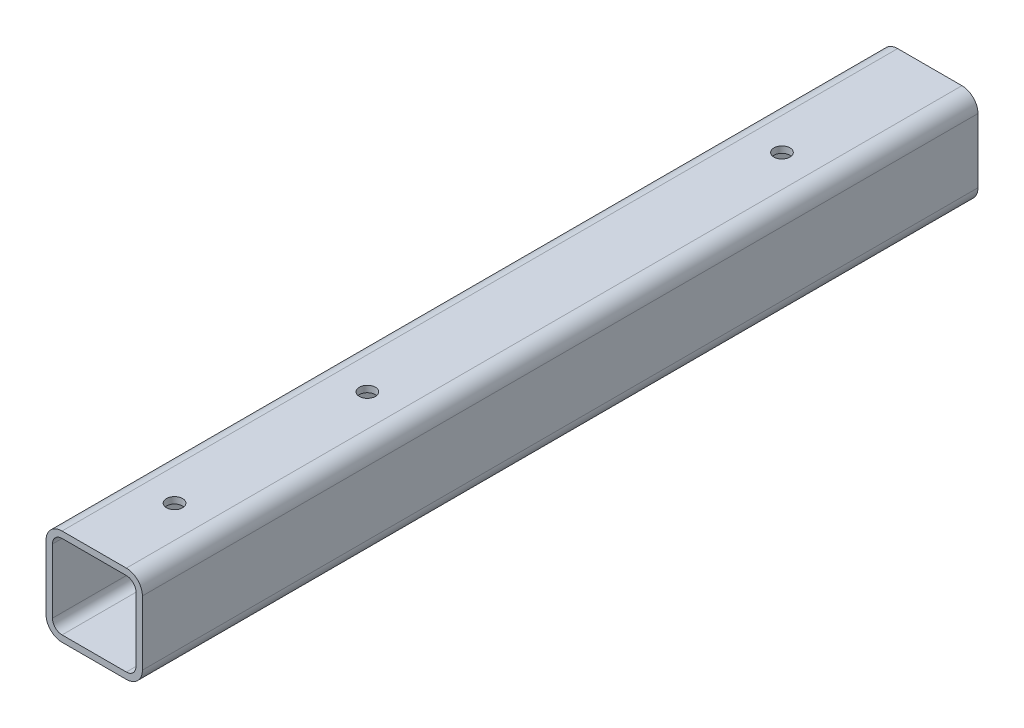
ISO-10303-21;
HEADER;
FILE_DESCRIPTION(('STEP AP214'),'2;1');
FILE_NAME('part.step','',(''),(''),'','','');
FILE_SCHEMA(('AUTOMOTIVE_DESIGN { 1 0 10303 214 1 1 1 1 }'));
ENDSEC;
DATA;
#1=APPLICATION_CONTEXT('core data for automotive mechanical design processes');
#2=APPLICATION_PROTOCOL_DEFINITION('international standard','automotive_design',2000,#1);
#3=PRODUCT_CONTEXT('',#1,'mechanical');
#4=PRODUCT('Part','Part','',(#3));
#5=PRODUCT_RELATED_PRODUCT_CATEGORY('part','',(#4));
#6=PRODUCT_DEFINITION_FORMATION('','',#4);
#7=PRODUCT_DEFINITION_CONTEXT('part definition',#1,'design');
#8=PRODUCT_DEFINITION('design','',#6,#7);
#9=PRODUCT_DEFINITION_SHAPE('','',#8);
#10=(LENGTH_UNIT() NAMED_UNIT(*) SI_UNIT(.MILLI.,.METRE.));
#11=(NAMED_UNIT(*) PLANE_ANGLE_UNIT() SI_UNIT($,.RADIAN.));
#12=(NAMED_UNIT(*) SI_UNIT($,.STERADIAN.) SOLID_ANGLE_UNIT());
#13=UNCERTAINTY_MEASURE_WITH_UNIT(LENGTH_MEASURE(1.E-05),#10,'distance_accuracy_value','');
#14=(GEOMETRIC_REPRESENTATION_CONTEXT(3) GLOBAL_UNCERTAINTY_ASSIGNED_CONTEXT((#13)) GLOBAL_UNIT_ASSIGNED_CONTEXT((#10,
#11,#12)) REPRESENTATION_CONTEXT('',''));
#15=CARTESIAN_POINT('',(0.,0.,0.));
#16=DIRECTION('',(0.,0.,1.));
#17=DIRECTION('',(1.,0.,0.));
#18=AXIS2_PLACEMENT_3D('',#15,#16,#17);
#19=CARTESIAN_POINT('',(10.,10.,130.));
#20=DIRECTION('',(0.,0.,-1.));
#21=DIRECTION('',(-1.,0.,0.));
#22=AXIS2_PLACEMENT_3D('',#19,#20,#21);
#23=PLANE('',#22);
#24=CARTESIAN_POINT('',(10.,10.,130.));
#25=DIRECTION('',(0.,0.,1.));
#26=DIRECTION('',(-1.,0.,0.));
#27=AXIS2_PLACEMENT_3D('',#24,#25,#26);
#28=CIRCLE('',#27,5.);
#29=CARTESIAN_POINT('',(15.,10.,130.));
#30=VERTEX_POINT('',#29);
#31=CARTESIAN_POINT('',(10.,15.,130.));
#32=VERTEX_POINT('',#31);
#33=EDGE_CURVE('E219',#30,#32,#28,.T.);
#34=ORIENTED_EDGE('',*,*,#33,.T.);
#35=DIRECTION('',(-1.,0.,0.));
#36=VECTOR('',#35,1.);
#37=CARTESIAN_POINT('',(-10.,15.,130.));
#38=LINE('',#37,#36);
#39=CARTESIAN_POINT('',(-10.,15.,130.));
#40=VERTEX_POINT('',#39);
#41=EDGE_CURVE('E222',#32,#40,#38,.T.);
#42=ORIENTED_EDGE('',*,*,#41,.T.);
#43=CARTESIAN_POINT('',(-10.,10.,130.));
#44=DIRECTION('',(0.,0.,1.));
#45=DIRECTION('',(1.,0.,0.));
#46=AXIS2_PLACEMENT_3D('',#43,#44,#45);
#47=CIRCLE('',#46,5.);
#48=CARTESIAN_POINT('',(-15.,10.,130.));
#49=VERTEX_POINT('',#48);
#50=EDGE_CURVE('E225',#40,#49,#47,.T.);
#51=ORIENTED_EDGE('',*,*,#50,.T.);
#52=DIRECTION('',(0.,-1.,0.));
#53=VECTOR('',#52,1.);
#54=CARTESIAN_POINT('',(-15.,10.,130.));
#55=LINE('',#54,#53);
#56=CARTESIAN_POINT('',(-15.,-10.,130.));
#57=VERTEX_POINT('',#56);
#58=EDGE_CURVE('E227',#49,#57,#55,.T.);
#59=ORIENTED_EDGE('',*,*,#58,.T.);
#60=CARTESIAN_POINT('',(-10.,-10.,130.));
#61=DIRECTION('',(0.,0.,1.));
#62=DIRECTION('',(-1.,0.,0.));
#63=AXIS2_PLACEMENT_3D('',#60,#61,#62);
#64=CIRCLE('',#63,5.);
#65=CARTESIAN_POINT('',(-10.,-15.,130.));
#66=VERTEX_POINT('',#65);
#67=EDGE_CURVE('E229',#57,#66,#64,.T.);
#68=ORIENTED_EDGE('',*,*,#67,.T.);
#69=DIRECTION('',(1.,0.,0.));
#70=VECTOR('',#69,1.);
#71=CARTESIAN_POINT('',(-10.,-15.,130.));
#72=LINE('',#71,#70);
#73=CARTESIAN_POINT('',(10.,-15.,130.));
#74=VERTEX_POINT('',#73);
#75=EDGE_CURVE('E231',#66,#74,#72,.T.);
#76=ORIENTED_EDGE('',*,*,#75,.T.);
#77=CARTESIAN_POINT('',(10.,-10.,130.));
#78=DIRECTION('',(0.,0.,1.));
#79=DIRECTION('',(1.,0.,0.));
#80=AXIS2_PLACEMENT_3D('',#77,#78,#79);
#81=CIRCLE('',#80,5.);
#82=CARTESIAN_POINT('',(15.,-10.,130.));
#83=VERTEX_POINT('',#82);
#84=EDGE_CURVE('E233',#74,#83,#81,.T.);
#85=ORIENTED_EDGE('',*,*,#84,.T.);
#86=DIRECTION('',(0.,1.,0.));
#87=VECTOR('',#86,1.);
#88=CARTESIAN_POINT('',(15.,10.,130.));
#89=LINE('',#88,#87);
#90=EDGE_CURVE('E235',#83,#30,#89,.T.);
#91=ORIENTED_EDGE('',*,*,#90,.T.);
#92=EDGE_LOOP('',(#34,#42,#51,#59,#68,#76,#85,#91));
#93=FACE_BOUND('',#92,.T.);
#94=CARTESIAN_POINT('',(-10.,10.,130.));
#95=DIRECTION('',(0.,0.,1.));
#96=DIRECTION('',(1.,0.,0.));
#97=AXIS2_PLACEMENT_3D('',#94,#95,#96);
#98=CIRCLE('',#97,3.);
#99=CARTESIAN_POINT('',(-10.,13.,130.));
#100=VERTEX_POINT('',#99);
#101=CARTESIAN_POINT('',(-13.,10.,130.));
#102=VERTEX_POINT('',#101);
#103=EDGE_CURVE('E152',#100,#102,#98,.T.);
#104=ORIENTED_EDGE('',*,*,#103,.F.);
#105=DIRECTION('',(-1.,0.,0.));
#106=VECTOR('',#105,1.);
#107=CARTESIAN_POINT('',(-10.,13.,130.));
#108=LINE('',#107,#106);
#109=CARTESIAN_POINT('',(10.,13.,130.));
#110=VERTEX_POINT('',#109);
#111=EDGE_CURVE('E186',#110,#100,#108,.T.);
#112=ORIENTED_EDGE('',*,*,#111,.F.);
#113=CARTESIAN_POINT('',(10.,10.,130.));
#114=DIRECTION('',(0.,0.,1.));
#115=DIRECTION('',(-1.,0.,0.));
#116=AXIS2_PLACEMENT_3D('',#113,#114,#115);
#117=CIRCLE('',#116,3.);
#118=CARTESIAN_POINT('',(13.,10.,130.));
#119=VERTEX_POINT('',#118);
#120=EDGE_CURVE('E184',#119,#110,#117,.T.);
#121=ORIENTED_EDGE('',*,*,#120,.F.);
#122=DIRECTION('',(0.,1.,0.));
#123=VECTOR('',#122,1.);
#124=CARTESIAN_POINT('',(13.,10.,130.));
#125=LINE('',#124,#123);
#126=CARTESIAN_POINT('',(13.,-10.,130.));
#127=VERTEX_POINT('',#126);
#128=EDGE_CURVE('E182',#127,#119,#125,.T.);
#129=ORIENTED_EDGE('',*,*,#128,.F.);
#130=CARTESIAN_POINT('',(10.,-10.,130.));
#131=DIRECTION('',(0.,0.,1.));
#132=DIRECTION('',(1.,0.,0.));
#133=AXIS2_PLACEMENT_3D('',#130,#131,#132);
#134=CIRCLE('',#133,3.);
#135=CARTESIAN_POINT('',(10.,-13.,130.));
#136=VERTEX_POINT('',#135);
#137=EDGE_CURVE('E180',#136,#127,#134,.T.);
#138=ORIENTED_EDGE('',*,*,#137,.F.);
#139=DIRECTION('',(1.,0.,0.));
#140=VECTOR('',#139,1.);
#141=CARTESIAN_POINT('',(-10.,-13.,130.));
#142=LINE('',#141,#140);
#143=CARTESIAN_POINT('',(-10.,-13.,130.));
#144=VERTEX_POINT('',#143);
#145=EDGE_CURVE('E175',#144,#136,#142,.T.);
#146=ORIENTED_EDGE('',*,*,#145,.F.);
#147=CARTESIAN_POINT('',(-10.,-10.,130.));
#148=DIRECTION('',(0.,0.,1.));
#149=DIRECTION('',(-1.,0.,0.));
#150=AXIS2_PLACEMENT_3D('',#147,#148,#149);
#151=CIRCLE('',#150,3.);
#152=CARTESIAN_POINT('',(-13.,-10.,130.));
#153=VERTEX_POINT('',#152);
#154=EDGE_CURVE('E173',#153,#144,#151,.T.);
#155=ORIENTED_EDGE('',*,*,#154,.F.);
#156=DIRECTION('',(0.,-1.,0.));
#157=VECTOR('',#156,1.);
#158=CARTESIAN_POINT('',(-13.,10.,130.));
#159=LINE('',#158,#157);
#160=EDGE_CURVE('E160',#102,#153,#159,.T.);
#161=ORIENTED_EDGE('',*,*,#160,.F.);
#162=EDGE_LOOP('',(#104,#112,#121,#129,#138,#146,#155,#161));
#163=FACE_BOUND('',#162,.T.);
#164=ADVANCED_FACE('F37',(#93,#163),#23,.F.);
#165=CARTESIAN_POINT('',(10.,10.,-130.));
#166=DIRECTION('',(0.,0.,-1.));
#167=DIRECTION('',(-1.,0.,0.));
#168=AXIS2_PLACEMENT_3D('',#165,#166,#167);
#169=PLANE('',#168);
#170=CARTESIAN_POINT('',(10.,10.,-130.));
#171=DIRECTION('',(0.,0.,1.));
#172=DIRECTION('',(-1.,0.,0.));
#173=AXIS2_PLACEMENT_3D('',#170,#171,#172);
#174=CIRCLE('',#173,5.);
#175=CARTESIAN_POINT('',(15.,10.,-130.));
#176=VERTEX_POINT('',#175);
#177=CARTESIAN_POINT('',(10.,15.,-130.));
#178=VERTEX_POINT('',#177);
#179=EDGE_CURVE('E168',#176,#178,#174,.T.);
#180=ORIENTED_EDGE('',*,*,#179,.F.);
#181=DIRECTION('',(0.,1.,0.));
#182=VECTOR('',#181,1.);
#183=CARTESIAN_POINT('',(15.,10.,-130.));
#184=LINE('',#183,#182);
#185=CARTESIAN_POINT('',(15.,-10.,-130.));
#186=VERTEX_POINT('',#185);
#187=EDGE_CURVE('E223',#186,#176,#184,.T.);
#188=ORIENTED_EDGE('',*,*,#187,.F.);
#189=CARTESIAN_POINT('',(10.,-10.,-130.));
#190=DIRECTION('',(0.,0.,1.));
#191=DIRECTION('',(1.,0.,0.));
#192=AXIS2_PLACEMENT_3D('',#189,#190,#191);
#193=CIRCLE('',#192,5.);
#194=CARTESIAN_POINT('',(10.,-15.,-130.));
#195=VERTEX_POINT('',#194);
#196=EDGE_CURVE('E250',#195,#186,#193,.T.);
#197=ORIENTED_EDGE('',*,*,#196,.F.);
#198=DIRECTION('',(1.,0.,0.));
#199=VECTOR('',#198,1.);
#200=CARTESIAN_POINT('',(-10.,-15.,-130.));
#201=LINE('',#200,#199);
#202=CARTESIAN_POINT('',(-10.,-15.,-130.));
#203=VERTEX_POINT('',#202);
#204=EDGE_CURVE('E248',#203,#195,#201,.T.);
#205=ORIENTED_EDGE('',*,*,#204,.F.);
#206=CARTESIAN_POINT('',(-10.,-10.,-130.));
#207=DIRECTION('',(0.,0.,1.));
#208=DIRECTION('',(-1.,0.,0.));
#209=AXIS2_PLACEMENT_3D('',#206,#207,#208);
#210=CIRCLE('',#209,5.);
#211=CARTESIAN_POINT('',(-15.,-10.,-130.));
#212=VERTEX_POINT('',#211);
#213=EDGE_CURVE('E246',#212,#203,#210,.T.);
#214=ORIENTED_EDGE('',*,*,#213,.F.);
#215=DIRECTION('',(0.,-1.,0.));
#216=VECTOR('',#215,1.);
#217=CARTESIAN_POINT('',(-15.,10.,-130.));
#218=LINE('',#217,#216);
#219=CARTESIAN_POINT('',(-15.,10.,-130.));
#220=VERTEX_POINT('',#219);
#221=EDGE_CURVE('E244',#220,#212,#218,.T.);
#222=ORIENTED_EDGE('',*,*,#221,.F.);
#223=CARTESIAN_POINT('',(-10.,10.,-130.));
#224=DIRECTION('',(0.,0.,1.));
#225=DIRECTION('',(1.,0.,0.));
#226=AXIS2_PLACEMENT_3D('',#223,#224,#225);
#227=CIRCLE('',#226,5.);
#228=CARTESIAN_POINT('',(-10.,15.,-130.));
#229=VERTEX_POINT('',#228);
#230=EDGE_CURVE('E242',#229,#220,#227,.T.);
#231=ORIENTED_EDGE('',*,*,#230,.F.);
#232=DIRECTION('',(-1.,0.,0.));
#233=VECTOR('',#232,1.);
#234=CARTESIAN_POINT('',(-10.,15.,-130.));
#235=LINE('',#234,#233);
#236=EDGE_CURVE('E240',#178,#229,#235,.T.);
#237=ORIENTED_EDGE('',*,*,#236,.F.);
#238=EDGE_LOOP('',(#180,#188,#197,#205,#214,#222,#231,#237));
#239=FACE_BOUND('',#238,.T.);
#240=DIRECTION('',(-1.,0.,0.));
#241=VECTOR('',#240,1.);
#242=CARTESIAN_POINT('',(-10.,13.,-130.));
#243=LINE('',#242,#241);
#244=CARTESIAN_POINT('',(10.,13.,-130.));
#245=VERTEX_POINT('',#244);
#246=CARTESIAN_POINT('',(-10.,13.,-130.));
#247=VERTEX_POINT('',#246);
#248=EDGE_CURVE('E161',#245,#247,#243,.T.);
#249=ORIENTED_EDGE('',*,*,#248,.T.);
#250=CARTESIAN_POINT('',(-10.,10.,-130.));
#251=DIRECTION('',(0.,0.,1.));
#252=DIRECTION('',(1.,0.,0.));
#253=AXIS2_PLACEMENT_3D('',#250,#251,#252);
#254=CIRCLE('',#253,3.);
#255=CARTESIAN_POINT('',(-13.,10.,-130.));
#256=VERTEX_POINT('',#255);
#257=EDGE_CURVE('E62',#247,#256,#254,.T.);
#258=ORIENTED_EDGE('',*,*,#257,.T.);
#259=DIRECTION('',(0.,-1.,0.));
#260=VECTOR('',#259,1.);
#261=CARTESIAN_POINT('',(-13.,10.,-130.));
#262=LINE('',#261,#260);
#263=CARTESIAN_POINT('',(-13.,-10.,-130.));
#264=VERTEX_POINT('',#263);
#265=EDGE_CURVE('E167',#256,#264,#262,.T.);
#266=ORIENTED_EDGE('',*,*,#265,.T.);
#267=CARTESIAN_POINT('',(-10.,-10.,-130.));
#268=DIRECTION('',(0.,0.,1.));
#269=DIRECTION('',(-1.,0.,0.));
#270=AXIS2_PLACEMENT_3D('',#267,#268,#269);
#271=CIRCLE('',#270,3.);
#272=CARTESIAN_POINT('',(-10.,-13.,-130.));
#273=VERTEX_POINT('',#272);
#274=EDGE_CURVE('E191',#264,#273,#271,.T.);
#275=ORIENTED_EDGE('',*,*,#274,.T.);
#276=DIRECTION('',(1.,0.,0.));
#277=VECTOR('',#276,1.);
#278=CARTESIAN_POINT('',(-10.,-13.,-130.));
#279=LINE('',#278,#277);
#280=CARTESIAN_POINT('',(10.,-13.,-130.));
#281=VERTEX_POINT('',#280);
#282=EDGE_CURVE('E194',#273,#281,#279,.T.);
#283=ORIENTED_EDGE('',*,*,#282,.T.);
#284=CARTESIAN_POINT('',(10.,-10.,-130.));
#285=DIRECTION('',(0.,0.,1.));
#286=DIRECTION('',(1.,0.,0.));
#287=AXIS2_PLACEMENT_3D('',#284,#285,#286);
#288=CIRCLE('',#287,3.);
#289=CARTESIAN_POINT('',(13.,-10.,-130.));
#290=VERTEX_POINT('',#289);
#291=EDGE_CURVE('E197',#281,#290,#288,.T.);
#292=ORIENTED_EDGE('',*,*,#291,.T.);
#293=DIRECTION('',(0.,1.,0.));
#294=VECTOR('',#293,1.);
#295=CARTESIAN_POINT('',(13.,10.,-130.));
#296=LINE('',#295,#294);
#297=CARTESIAN_POINT('',(13.,10.,-130.));
#298=VERTEX_POINT('',#297);
#299=EDGE_CURVE('E200',#290,#298,#296,.T.);
#300=ORIENTED_EDGE('',*,*,#299,.T.);
#301=CARTESIAN_POINT('',(10.,10.,-130.));
#302=DIRECTION('',(0.,0.,1.));
#303=DIRECTION('',(-1.,0.,0.));
#304=AXIS2_PLACEMENT_3D('',#301,#302,#303);
#305=CIRCLE('',#304,3.);
#306=EDGE_CURVE('E203',#298,#245,#305,.T.);
#307=ORIENTED_EDGE('',*,*,#306,.T.);
#308=EDGE_LOOP('',(#249,#258,#266,#275,#283,#292,#300,#307));
#309=FACE_BOUND('',#308,.T.);
#310=ADVANCED_FACE('F323',(#239,#309),#169,.T.);
#311=CARTESIAN_POINT('',(10.,10.,130.));
#312=DIRECTION('',(0.,0.,-1.));
#313=DIRECTION('',(-1.,0.,0.));
#314=AXIS2_PLACEMENT_3D('',#311,#312,#313);
#315=CYLINDRICAL_SURFACE('',#314,5.);
#316=ORIENTED_EDGE('',*,*,#179,.T.);
#317=DIRECTION('',(0.,0.,-1.));
#318=VECTOR('',#317,1.);
#319=CARTESIAN_POINT('',(10.,15.,130.));
#320=LINE('',#319,#318);
#321=EDGE_CURVE('E11',#32,#178,#320,.T.);
#322=ORIENTED_EDGE('',*,*,#321,.F.);
#323=ORIENTED_EDGE('',*,*,#33,.F.);
#324=DIRECTION('',(0.,0.,-1.));
#325=VECTOR('',#324,1.);
#326=CARTESIAN_POINT('',(15.,10.,130.));
#327=LINE('',#326,#325);
#328=EDGE_CURVE('E237',#30,#176,#327,.T.);
#329=ORIENTED_EDGE('',*,*,#328,.T.);
#330=EDGE_LOOP('',(#316,#322,#323,#329));
#331=FACE_BOUND('',#330,.T.);
#332=ADVANCED_FACE('F39',(#331),#315,.T.);
#333=CARTESIAN_POINT('',(-10.,15.,130.));
#334=DIRECTION('',(0.,-1.,0.));
#335=DIRECTION('',(0.,0.,-1.));
#336=AXIS2_PLACEMENT_3D('',#333,#334,#335);
#337=PLANE('',#336);
#338=CARTESIAN_POINT('',(0.,15.,-84.));
#339=DIRECTION('',(0.,-1.,0.));
#340=DIRECTION('',(0.,0.,-1.));
#341=AXIS2_PLACEMENT_3D('',#338,#339,#340);
#342=CIRCLE('',#341,2.5);
#343=CARTESIAN_POINT('',(0.,15.,-86.5));
#344=VERTEX_POINT('',#343);
#345=EDGE_CURVE('E189',#344,#344,#342,.T.);
#346=ORIENTED_EDGE('',*,*,#345,.T.);
#347=EDGE_LOOP('',(#346));
#348=FACE_BOUND('',#347,.T.);
#349=CARTESIAN_POINT('',(0.,15.,105.));
#350=DIRECTION('',(0.,-1.,0.));
#351=DIRECTION('',(0.,0.,-1.));
#352=AXIS2_PLACEMENT_3D('',#349,#350,#351);
#353=CIRCLE('',#352,2.5);
#354=CARTESIAN_POINT('',(0.,15.,102.5));
#355=VERTEX_POINT('',#354);
#356=EDGE_CURVE('E283',#355,#355,#353,.T.);
#357=ORIENTED_EDGE('',*,*,#356,.T.);
#358=EDGE_LOOP('',(#357));
#359=FACE_BOUND('',#358,.T.);
#360=CARTESIAN_POINT('',(0.,15.,45.));
#361=DIRECTION('',(0.,-1.,0.));
#362=DIRECTION('',(0.,0.,-1.));
#363=AXIS2_PLACEMENT_3D('',#360,#361,#362);
#364=CIRCLE('',#363,2.5);
#365=CARTESIAN_POINT('',(0.,15.,42.5));
#366=VERTEX_POINT('',#365);
#367=EDGE_CURVE('E279',#366,#366,#364,.T.);
#368=ORIENTED_EDGE('',*,*,#367,.T.);
#369=EDGE_LOOP('',(#368));
#370=FACE_BOUND('',#369,.T.);
#371=ORIENTED_EDGE('',*,*,#236,.T.);
#372=DIRECTION('',(0.,0.,-1.));
#373=VECTOR('',#372,1.);
#374=CARTESIAN_POINT('',(-10.,15.,130.));
#375=LINE('',#374,#373);
#376=EDGE_CURVE('E46',#40,#229,#375,.T.);
#377=ORIENTED_EDGE('',*,*,#376,.F.);
#378=ORIENTED_EDGE('',*,*,#41,.F.);
#379=ORIENTED_EDGE('',*,*,#321,.T.);
#380=EDGE_LOOP('',(#371,#377,#378,#379));
#381=FACE_BOUND('',#380,.T.);
#382=ADVANCED_FACE('F300',(#348,#359,#370,#381),#337,.F.);
#383=CARTESIAN_POINT('',(-10.,10.,130.));
#384=DIRECTION('',(0.,0.,-1.));
#385=DIRECTION('',(-1.,0.,0.));
#386=AXIS2_PLACEMENT_3D('',#383,#384,#385);
#387=CYLINDRICAL_SURFACE('',#386,5.);
#388=ORIENTED_EDGE('',*,*,#230,.T.);
#389=DIRECTION('',(0.,0.,-1.));
#390=VECTOR('',#389,1.);
#391=CARTESIAN_POINT('',(-15.,10.,130.));
#392=LINE('',#391,#390);
#393=EDGE_CURVE('E267',#49,#220,#392,.T.);
#394=ORIENTED_EDGE('',*,*,#393,.F.);
#395=ORIENTED_EDGE('',*,*,#50,.F.);
#396=ORIENTED_EDGE('',*,*,#376,.T.);
#397=EDGE_LOOP('',(#388,#394,#395,#396));
#398=FACE_BOUND('',#397,.T.);
#399=ADVANCED_FACE('F353',(#398),#387,.T.);
#400=CARTESIAN_POINT('',(-15.,10.,130.));
#401=DIRECTION('',(1.,0.,0.));
#402=DIRECTION('',(0.,0.,-1.));
#403=AXIS2_PLACEMENT_3D('',#400,#401,#402);
#404=PLANE('',#403);
#405=ORIENTED_EDGE('',*,*,#221,.T.);
#406=DIRECTION('',(0.,0.,-1.));
#407=VECTOR('',#406,1.);
#408=CARTESIAN_POINT('',(-15.,-10.,130.));
#409=LINE('',#408,#407);
#410=EDGE_CURVE('E264',#57,#212,#409,.T.);
#411=ORIENTED_EDGE('',*,*,#410,.F.);
#412=ORIENTED_EDGE('',*,*,#58,.F.);
#413=ORIENTED_EDGE('',*,*,#393,.T.);
#414=EDGE_LOOP('',(#405,#411,#412,#413));
#415=FACE_BOUND('',#414,.T.);
#416=ADVANCED_FACE('F349',(#415),#404,.F.);
#417=CARTESIAN_POINT('',(-10.,-10.,130.));
#418=DIRECTION('',(0.,0.,-1.));
#419=DIRECTION('',(-1.,0.,0.));
#420=AXIS2_PLACEMENT_3D('',#417,#418,#419);
#421=CYLINDRICAL_SURFACE('',#420,5.);
#422=ORIENTED_EDGE('',*,*,#213,.T.);
#423=DIRECTION('',(0.,0.,-1.));
#424=VECTOR('',#423,1.);
#425=CARTESIAN_POINT('',(-10.,-15.,130.));
#426=LINE('',#425,#424);
#427=EDGE_CURVE('E261',#66,#203,#426,.T.);
#428=ORIENTED_EDGE('',*,*,#427,.F.);
#429=ORIENTED_EDGE('',*,*,#67,.F.);
#430=ORIENTED_EDGE('',*,*,#410,.T.);
#431=EDGE_LOOP('',(#422,#428,#429,#430));
#432=FACE_BOUND('',#431,.T.);
#433=ADVANCED_FACE('F345',(#432),#421,.T.);
#434=CARTESIAN_POINT('',(-10.,-15.,130.));
#435=DIRECTION('',(0.,1.,0.));
#436=DIRECTION('',(0.,0.,1.));
#437=AXIS2_PLACEMENT_3D('',#434,#435,#436);
#438=PLANE('',#437);
#439=CARTESIAN_POINT('',(0.,-15.,-84.));
#440=DIRECTION('',(0.,-1.,0.));
#441=DIRECTION('',(0.,0.,-1.));
#442=AXIS2_PLACEMENT_3D('',#439,#440,#441);
#443=CIRCLE('',#442,2.5);
#444=CARTESIAN_POINT('',(0.,-15.,-86.5));
#445=VERTEX_POINT('',#444);
#446=EDGE_CURVE('E275',#445,#445,#443,.T.);
#447=ORIENTED_EDGE('',*,*,#446,.F.);
#448=EDGE_LOOP('',(#447));
#449=FACE_BOUND('',#448,.T.);
#450=CARTESIAN_POINT('',(0.,-15.,105.));
#451=DIRECTION('',(0.,-1.,0.));
#452=DIRECTION('',(0.,0.,-1.));
#453=AXIS2_PLACEMENT_3D('',#450,#451,#452);
#454=CIRCLE('',#453,2.5);
#455=CARTESIAN_POINT('',(0.,-15.,102.5));
#456=VERTEX_POINT('',#455);
#457=EDGE_CURVE('E477',#456,#456,#454,.T.);
#458=ORIENTED_EDGE('',*,*,#457,.F.);
#459=EDGE_LOOP('',(#458));
#460=FACE_BOUND('',#459,.T.);
#461=CARTESIAN_POINT('',(0.,-15.,45.));
#462=DIRECTION('',(0.,-1.,0.));
#463=DIRECTION('',(0.,0.,-1.));
#464=AXIS2_PLACEMENT_3D('',#461,#462,#463);
#465=CIRCLE('',#464,2.5);
#466=CARTESIAN_POINT('',(0.,-15.,42.5));
#467=VERTEX_POINT('',#466);
#468=EDGE_CURVE('E479',#467,#467,#465,.T.);
#469=ORIENTED_EDGE('',*,*,#468,.F.);
#470=EDGE_LOOP('',(#469));
#471=FACE_BOUND('',#470,.T.);
#472=ORIENTED_EDGE('',*,*,#204,.T.);
#473=DIRECTION('',(0.,0.,-1.));
#474=VECTOR('',#473,1.);
#475=CARTESIAN_POINT('',(10.,-15.,130.));
#476=LINE('',#475,#474);
#477=EDGE_CURVE('E258',#74,#195,#476,.T.);
#478=ORIENTED_EDGE('',*,*,#477,.F.);
#479=ORIENTED_EDGE('',*,*,#75,.F.);
#480=ORIENTED_EDGE('',*,*,#427,.T.);
#481=EDGE_LOOP('',(#472,#478,#479,#480));
#482=FACE_BOUND('',#481,.T.);
#483=ADVANCED_FACE('F341',(#449,#460,#471,#482),#438,.F.);
#484=CARTESIAN_POINT('',(10.,-10.,130.));
#485=DIRECTION('',(0.,0.,-1.));
#486=DIRECTION('',(-1.,0.,0.));
#487=AXIS2_PLACEMENT_3D('',#484,#485,#486);
#488=CYLINDRICAL_SURFACE('',#487,5.);
#489=ORIENTED_EDGE('',*,*,#196,.T.);
#490=DIRECTION('',(0.,0.,-1.));
#491=VECTOR('',#490,1.);
#492=CARTESIAN_POINT('',(15.,-10.,130.));
#493=LINE('',#492,#491);
#494=EDGE_CURVE('E255',#83,#186,#493,.T.);
#495=ORIENTED_EDGE('',*,*,#494,.F.);
#496=ORIENTED_EDGE('',*,*,#84,.F.);
#497=ORIENTED_EDGE('',*,*,#477,.T.);
#498=EDGE_LOOP('',(#489,#495,#496,#497));
#499=FACE_BOUND('',#498,.T.);
#500=ADVANCED_FACE('F337',(#499),#488,.T.);
#501=CARTESIAN_POINT('',(15.,10.,130.));
#502=DIRECTION('',(-1.,0.,0.));
#503=DIRECTION('',(0.,0.,1.));
#504=AXIS2_PLACEMENT_3D('',#501,#502,#503);
#505=PLANE('',#504);
#506=ORIENTED_EDGE('',*,*,#187,.T.);
#507=ORIENTED_EDGE('',*,*,#328,.F.);
#508=ORIENTED_EDGE('',*,*,#90,.F.);
#509=ORIENTED_EDGE('',*,*,#494,.T.);
#510=EDGE_LOOP('',(#506,#507,#508,#509));
#511=FACE_BOUND('',#510,.T.);
#512=ADVANCED_FACE('F334',(#511),#505,.F.);
#513=CARTESIAN_POINT('',(-10.,10.,130.));
#514=DIRECTION('',(0.,0.,-1.));
#515=DIRECTION('',(-1.,0.,0.));
#516=AXIS2_PLACEMENT_3D('',#513,#514,#515);
#517=CYLINDRICAL_SURFACE('',#516,3.);
#518=ORIENTED_EDGE('',*,*,#257,.F.);
#519=DIRECTION('',(0.,0.,-1.));
#520=VECTOR('',#519,1.);
#521=CARTESIAN_POINT('',(-10.,13.,130.));
#522=LINE('',#521,#520);
#523=EDGE_CURVE('E156',#100,#247,#522,.T.);
#524=ORIENTED_EDGE('',*,*,#523,.F.);
#525=ORIENTED_EDGE('',*,*,#103,.T.);
#526=DIRECTION('',(0.,0.,-1.));
#527=VECTOR('',#526,1.);
#528=CARTESIAN_POINT('',(-13.,10.,130.));
#529=LINE('',#528,#527);
#530=EDGE_CURVE('E155',#102,#256,#529,.T.);
#531=ORIENTED_EDGE('',*,*,#530,.T.);
#532=EDGE_LOOP('',(#518,#524,#525,#531));
#533=FACE_BOUND('',#532,.T.);
#534=ADVANCED_FACE('F154',(#533),#517,.F.);
#535=CARTESIAN_POINT('',(-13.,10.,130.));
#536=DIRECTION('',(1.,0.,0.));
#537=DIRECTION('',(0.,1.,0.));
#538=AXIS2_PLACEMENT_3D('',#535,#536,#537);
#539=PLANE('',#538);
#540=ORIENTED_EDGE('',*,*,#265,.F.);
#541=ORIENTED_EDGE('',*,*,#530,.F.);
#542=ORIENTED_EDGE('',*,*,#160,.T.);
#543=DIRECTION('',(0.,0.,-1.));
#544=VECTOR('',#543,1.);
#545=CARTESIAN_POINT('',(-13.,-10.,130.));
#546=LINE('',#545,#544);
#547=EDGE_CURVE('E169',#153,#264,#546,.T.);
#548=ORIENTED_EDGE('',*,*,#547,.T.);
#549=EDGE_LOOP('',(#540,#541,#542,#548));
#550=FACE_BOUND('',#549,.T.);
#551=ADVANCED_FACE('F164',(#550),#539,.T.);
#552=CARTESIAN_POINT('',(-10.,-10.,130.));
#553=DIRECTION('',(0.,0.,-1.));
#554=DIRECTION('',(-1.,0.,0.));
#555=AXIS2_PLACEMENT_3D('',#552,#553,#554);
#556=CYLINDRICAL_SURFACE('',#555,3.);
#557=ORIENTED_EDGE('',*,*,#274,.F.);
#558=ORIENTED_EDGE('',*,*,#547,.F.);
#559=ORIENTED_EDGE('',*,*,#154,.T.);
#560=DIRECTION('',(0.,0.,-1.));
#561=VECTOR('',#560,1.);
#562=CARTESIAN_POINT('',(-10.,-13.,130.));
#563=LINE('',#562,#561);
#564=EDGE_CURVE('E216',#144,#273,#563,.T.);
#565=ORIENTED_EDGE('',*,*,#564,.T.);
#566=EDGE_LOOP('',(#557,#558,#559,#565));
#567=FACE_BOUND('',#566,.T.);
#568=ADVANCED_FACE('F412',(#567),#556,.F.);
#569=CARTESIAN_POINT('',(-10.,-13.,130.));
#570=DIRECTION('',(0.,1.,0.));
#571=DIRECTION('',(-1.,0.,0.));
#572=AXIS2_PLACEMENT_3D('',#569,#570,#571);
#573=PLANE('',#572);
#574=CARTESIAN_POINT('',(0.,-13.,-84.));
#575=DIRECTION('',(0.,1.,0.));
#576=DIRECTION('',(-1.,0.,0.));
#577=AXIS2_PLACEMENT_3D('',#574,#575,#576);
#578=CIRCLE('',#577,2.5);
#579=CARTESIAN_POINT('',(-2.49999999999999,-13.,-84.));
#580=VERTEX_POINT('',#579);
#581=EDGE_CURVE('E295',#580,#580,#578,.T.);
#582=ORIENTED_EDGE('',*,*,#581,.F.);
#583=EDGE_LOOP('',(#582));
#584=FACE_BOUND('',#583,.T.);
#585=CARTESIAN_POINT('',(0.,-13.,105.));
#586=DIRECTION('',(0.,1.,0.));
#587=DIRECTION('',(-1.,0.,0.));
#588=AXIS2_PLACEMENT_3D('',#585,#586,#587);
#589=CIRCLE('',#588,2.5);
#590=CARTESIAN_POINT('',(-2.5,-13.,105.));
#591=VERTEX_POINT('',#590);
#592=EDGE_CURVE('E278',#591,#591,#589,.T.);
#593=ORIENTED_EDGE('',*,*,#592,.F.);
#594=EDGE_LOOP('',(#593));
#595=FACE_BOUND('',#594,.T.);
#596=CARTESIAN_POINT('',(0.,-13.,45.));
#597=DIRECTION('',(0.,1.,0.));
#598=DIRECTION('',(-1.,0.,0.));
#599=AXIS2_PLACEMENT_3D('',#596,#597,#598);
#600=CIRCLE('',#599,2.5);
#601=CARTESIAN_POINT('',(-2.5,-13.,45.));
#602=VERTEX_POINT('',#601);
#603=EDGE_CURVE('E274',#602,#602,#600,.T.);
#604=ORIENTED_EDGE('',*,*,#603,.F.);
#605=EDGE_LOOP('',(#604));
#606=FACE_BOUND('',#605,.T.);
#607=ORIENTED_EDGE('',*,*,#282,.F.);
#608=ORIENTED_EDGE('',*,*,#564,.F.);
#609=ORIENTED_EDGE('',*,*,#145,.T.);
#610=DIRECTION('',(0.,0.,-1.));
#611=VECTOR('',#610,1.);
#612=CARTESIAN_POINT('',(10.,-13.,130.));
#613=LINE('',#612,#611);
#614=EDGE_CURVE('E214',#136,#281,#613,.T.);
#615=ORIENTED_EDGE('',*,*,#614,.T.);
#616=EDGE_LOOP('',(#607,#608,#609,#615));
#617=FACE_BOUND('',#616,.T.);
#618=ADVANCED_FACE('F409',(#584,#595,#606,#617),#573,.T.);
#619=CARTESIAN_POINT('',(10.,-10.,130.));
#620=DIRECTION('',(0.,0.,-1.));
#621=DIRECTION('',(-1.,0.,0.));
#622=AXIS2_PLACEMENT_3D('',#619,#620,#621);
#623=CYLINDRICAL_SURFACE('',#622,3.);
#624=ORIENTED_EDGE('',*,*,#291,.F.);
#625=ORIENTED_EDGE('',*,*,#614,.F.);
#626=ORIENTED_EDGE('',*,*,#137,.T.);
#627=DIRECTION('',(0.,0.,-1.));
#628=VECTOR('',#627,1.);
#629=CARTESIAN_POINT('',(13.,-10.,130.));
#630=LINE('',#629,#628);
#631=EDGE_CURVE('E212',#127,#290,#630,.T.);
#632=ORIENTED_EDGE('',*,*,#631,.T.);
#633=EDGE_LOOP('',(#624,#625,#626,#632));
#634=FACE_BOUND('',#633,.T.);
#635=ADVANCED_FACE('F404',(#634),#623,.F.);
#636=CARTESIAN_POINT('',(13.,10.,130.));
#637=DIRECTION('',(-1.,0.,0.));
#638=DIRECTION('',(0.,-1.,0.));
#639=AXIS2_PLACEMENT_3D('',#636,#637,#638);
#640=PLANE('',#639);
#641=ORIENTED_EDGE('',*,*,#299,.F.);
#642=ORIENTED_EDGE('',*,*,#631,.F.);
#643=ORIENTED_EDGE('',*,*,#128,.T.);
#644=DIRECTION('',(0.,0.,-1.));
#645=VECTOR('',#644,1.);
#646=CARTESIAN_POINT('',(13.,10.,130.));
#647=LINE('',#646,#645);
#648=EDGE_CURVE('E210',#119,#298,#647,.T.);
#649=ORIENTED_EDGE('',*,*,#648,.T.);
#650=EDGE_LOOP('',(#641,#642,#643,#649));
#651=FACE_BOUND('',#650,.T.);
#652=ADVANCED_FACE('F400',(#651),#640,.T.);
#653=CARTESIAN_POINT('',(10.,10.,130.));
#654=DIRECTION('',(0.,0.,-1.));
#655=DIRECTION('',(-1.,0.,0.));
#656=AXIS2_PLACEMENT_3D('',#653,#654,#655);
#657=CYLINDRICAL_SURFACE('',#656,3.);
#658=ORIENTED_EDGE('',*,*,#306,.F.);
#659=ORIENTED_EDGE('',*,*,#648,.F.);
#660=ORIENTED_EDGE('',*,*,#120,.T.);
#661=DIRECTION('',(0.,0.,-1.));
#662=VECTOR('',#661,1.);
#663=CARTESIAN_POINT('',(10.,13.,130.));
#664=LINE('',#663,#662);
#665=EDGE_CURVE('E54',#110,#245,#664,.T.);
#666=ORIENTED_EDGE('',*,*,#665,.T.);
#667=EDGE_LOOP('',(#658,#659,#660,#666));
#668=FACE_BOUND('',#667,.T.);
#669=ADVANCED_FACE('F397',(#668),#657,.F.);
#670=CARTESIAN_POINT('',(-10.,13.,130.));
#671=DIRECTION('',(0.,-1.,0.));
#672=DIRECTION('',(1.,0.,0.));
#673=AXIS2_PLACEMENT_3D('',#670,#671,#672);
#674=PLANE('',#673);
#675=CARTESIAN_POINT('',(0.,13.,-84.));
#676=DIRECTION('',(0.,-1.,0.));
#677=DIRECTION('',(1.,0.,0.));
#678=AXIS2_PLACEMENT_3D('',#675,#676,#677);
#679=CIRCLE('',#678,2.5);
#680=CARTESIAN_POINT('',(2.50000000000001,13.,-84.));
#681=VERTEX_POINT('',#680);
#682=EDGE_CURVE('E41',#681,#681,#679,.T.);
#683=ORIENTED_EDGE('',*,*,#682,.F.);
#684=EDGE_LOOP('',(#683));
#685=FACE_BOUND('',#684,.T.);
#686=CARTESIAN_POINT('',(0.,13.,105.));
#687=DIRECTION('',(0.,-1.,0.));
#688=DIRECTION('',(1.,0.,0.));
#689=AXIS2_PLACEMENT_3D('',#686,#687,#688);
#690=CIRCLE('',#689,2.5);
#691=CARTESIAN_POINT('',(2.5,13.,105.));
#692=VERTEX_POINT('',#691);
#693=EDGE_CURVE('E276',#692,#692,#690,.T.);
#694=ORIENTED_EDGE('',*,*,#693,.F.);
#695=EDGE_LOOP('',(#694));
#696=FACE_BOUND('',#695,.T.);
#697=CARTESIAN_POINT('',(0.,13.,45.));
#698=DIRECTION('',(0.,-1.,0.));
#699=DIRECTION('',(1.,0.,0.));
#700=AXIS2_PLACEMENT_3D('',#697,#698,#699);
#701=CIRCLE('',#700,2.5);
#702=CARTESIAN_POINT('',(2.5,13.,45.));
#703=VERTEX_POINT('',#702);
#704=EDGE_CURVE('E272',#703,#703,#701,.T.);
#705=ORIENTED_EDGE('',*,*,#704,.F.);
#706=EDGE_LOOP('',(#705));
#707=FACE_BOUND('',#706,.T.);
#708=ORIENTED_EDGE('',*,*,#248,.F.);
#709=ORIENTED_EDGE('',*,*,#665,.F.);
#710=ORIENTED_EDGE('',*,*,#111,.T.);
#711=ORIENTED_EDGE('',*,*,#523,.T.);
#712=EDGE_LOOP('',(#708,#709,#710,#711));
#713=FACE_BOUND('',#712,.T.);
#714=ADVANCED_FACE('F391',(#685,#696,#707,#713),#674,.T.);
#715=CARTESIAN_POINT('',(0.,45.,45.));
#716=DIRECTION('',(0.,-1.,0.));
#717=DIRECTION('',(0.,0.,-1.));
#718=AXIS2_PLACEMENT_3D('',#715,#716,#717);
#719=CYLINDRICAL_SURFACE('',#718,2.5);
#720=ORIENTED_EDGE('',*,*,#704,.T.);
#721=EDGE_LOOP('',(#720));
#722=FACE_BOUND('',#721,.T.);
#723=ORIENTED_EDGE('',*,*,#367,.F.);
#724=EDGE_LOOP('',(#723));
#725=FACE_BOUND('',#724,.T.);
#726=ADVANCED_FACE('F317',(#722,#725),#719,.F.);
#727=CARTESIAN_POINT('',(0.,45.,105.));
#728=DIRECTION('',(0.,-1.,0.));
#729=DIRECTION('',(0.,0.,-1.));
#730=AXIS2_PLACEMENT_3D('',#727,#728,#729);
#731=CYLINDRICAL_SURFACE('',#730,2.5);
#732=ORIENTED_EDGE('',*,*,#693,.T.);
#733=EDGE_LOOP('',(#732));
#734=FACE_BOUND('',#733,.T.);
#735=ORIENTED_EDGE('',*,*,#356,.F.);
#736=EDGE_LOOP('',(#735));
#737=FACE_BOUND('',#736,.T.);
#738=ADVANCED_FACE('F306',(#734,#737),#731,.F.);
#739=CARTESIAN_POINT('',(0.,45.,-84.));
#740=DIRECTION('',(0.,-1.,0.));
#741=DIRECTION('',(0.,0.,-1.));
#742=AXIS2_PLACEMENT_3D('',#739,#740,#741);
#743=CYLINDRICAL_SURFACE('',#742,2.5);
#744=ORIENTED_EDGE('',*,*,#682,.T.);
#745=EDGE_LOOP('',(#744));
#746=FACE_BOUND('',#745,.T.);
#747=ORIENTED_EDGE('',*,*,#345,.F.);
#748=EDGE_LOOP('',(#747));
#749=FACE_BOUND('',#748,.T.);
#750=ADVANCED_FACE('F303',(#746,#749),#743,.F.);
#751=ORIENTED_EDGE('',*,*,#603,.T.);
#752=EDGE_LOOP('',(#751));
#753=FACE_BOUND('',#752,.T.);
#754=ORIENTED_EDGE('',*,*,#468,.T.);
#755=EDGE_LOOP('',(#754));
#756=FACE_BOUND('',#755,.T.);
#757=ADVANCED_FACE('F305',(#753,#756),#719,.F.);
#758=ORIENTED_EDGE('',*,*,#592,.T.);
#759=EDGE_LOOP('',(#758));
#760=FACE_BOUND('',#759,.T.);
#761=ORIENTED_EDGE('',*,*,#457,.T.);
#762=EDGE_LOOP('',(#761));
#763=FACE_BOUND('',#762,.T.);
#764=ADVANCED_FACE('F314',(#760,#763),#731,.F.);
#765=ORIENTED_EDGE('',*,*,#581,.T.);
#766=EDGE_LOOP('',(#765));
#767=FACE_BOUND('',#766,.T.);
#768=ORIENTED_EDGE('',*,*,#446,.T.);
#769=EDGE_LOOP('',(#768));
#770=FACE_BOUND('',#769,.T.);
#771=ADVANCED_FACE('F309',(#767,#770),#743,.F.);
#772=CLOSED_SHELL('',(#164,#310,#332,#382,#399,#416,#433,#483,#500,#512,#534,#551,#568,#618,
#635,#652,#669,#714,#726,#738,#750,#757,#764,#771));
#773=MANIFOLD_SOLID_BREP('B2',#772);
#774=ADVANCED_BREP_SHAPE_REPRESENTATION('',(#18,#773),#14);
#775=SHAPE_DEFINITION_REPRESENTATION(#9,#774);
ENDSEC;
END-ISO-10303-21;
